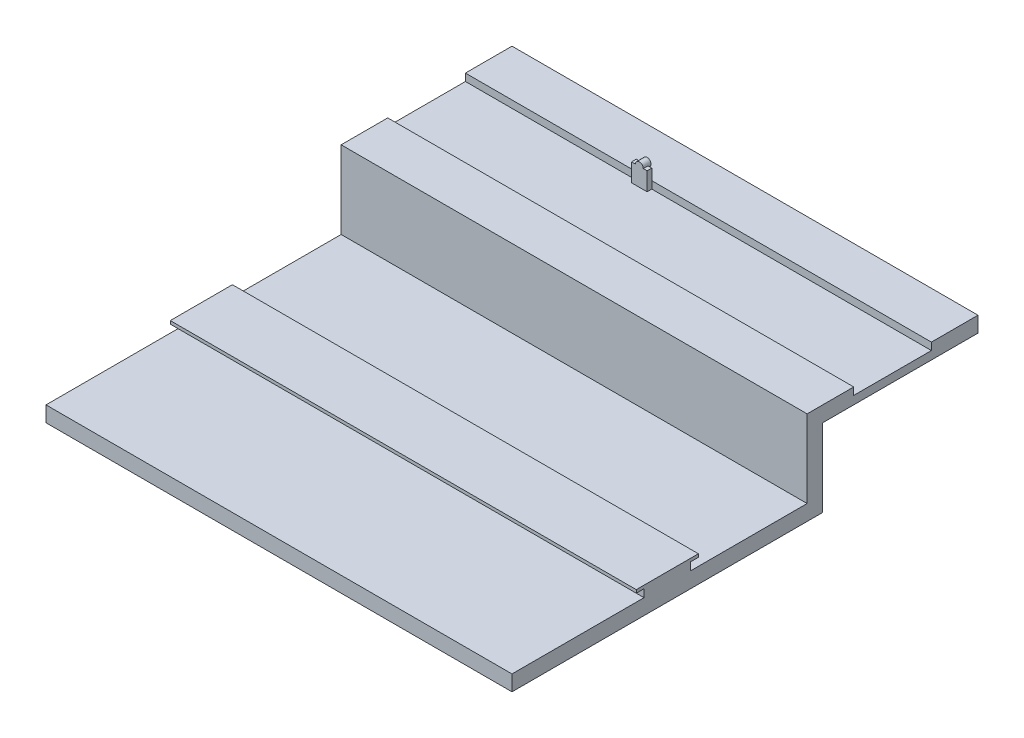
ISO-10303-21;
HEADER;
FILE_DESCRIPTION(('STEP AP214'),'2;1');
FILE_NAME('part.step','',(''),(''),'','','');
FILE_SCHEMA(('AUTOMOTIVE_DESIGN { 1 0 10303 214 1 1 1 1 }'));
ENDSEC;
DATA;
#1=APPLICATION_CONTEXT('core data for automotive mechanical design processes');
#2=APPLICATION_PROTOCOL_DEFINITION('international standard','automotive_design',2000,#1);
#3=PRODUCT_CONTEXT('',#1,'mechanical');
#4=PRODUCT('Part','Part','',(#3));
#5=PRODUCT_RELATED_PRODUCT_CATEGORY('part','',(#4));
#6=PRODUCT_DEFINITION_FORMATION('','',#4);
#7=PRODUCT_DEFINITION_CONTEXT('part definition',#1,'design');
#8=PRODUCT_DEFINITION('design','',#6,#7);
#9=PRODUCT_DEFINITION_SHAPE('','',#8);
#10=(LENGTH_UNIT() NAMED_UNIT(*) SI_UNIT(.MILLI.,.METRE.));
#11=(NAMED_UNIT(*) PLANE_ANGLE_UNIT() SI_UNIT($,.RADIAN.));
#12=(NAMED_UNIT(*) SI_UNIT($,.STERADIAN.) SOLID_ANGLE_UNIT());
#13=UNCERTAINTY_MEASURE_WITH_UNIT(LENGTH_MEASURE(1.E-05),#10,'distance_accuracy_value','');
#14=(GEOMETRIC_REPRESENTATION_CONTEXT(3) GLOBAL_UNCERTAINTY_ASSIGNED_CONTEXT((#13)) GLOBAL_UNIT_ASSIGNED_CONTEXT((#10,
#11,#12)) REPRESENTATION_CONTEXT('',''));
#15=CARTESIAN_POINT('',(0.,0.,0.));
#16=DIRECTION('',(0.,0.,1.));
#17=DIRECTION('',(1.,0.,0.));
#18=AXIS2_PLACEMENT_3D('',#15,#16,#17);
#19=CARTESIAN_POINT('',(-150.00005,67.2828121816727,-170.));
#20=DIRECTION('',(0.,0.,-1.));
#21=DIRECTION('',(-1.,0.,0.));
#22=AXIS2_PLACEMENT_3D('',#19,#20,#21);
#23=PLANE('',#22);
#24=DIRECTION('',(-1.,0.,0.));
#25=VECTOR('',#24,1.);
#26=CARTESIAN_POINT('',(-150.,55.,-170.));
#27=LINE('',#26,#25);
#28=CARTESIAN_POINT('',(150.,55.,-170.));
#29=VERTEX_POINT('',#28);
#30=CARTESIAN_POINT('',(-30.,55.,-170.));
#31=VERTEX_POINT('',#30);
#32=EDGE_CURVE('E324',#29,#31,#27,.T.);
#33=ORIENTED_EDGE('',*,*,#32,.T.);
#34=DIRECTION('',(0.,-1.,0.));
#35=VECTOR('',#34,1.);
#36=CARTESIAN_POINT('',(-30.,67.2828121816727,-170.));
#37=LINE('',#36,#35);
#38=CARTESIAN_POINT('',(-30.,50.2867748096281,-170.));
#39=VERTEX_POINT('',#38);
#40=EDGE_CURVE('E45',#31,#39,#37,.T.);
#41=ORIENTED_EDGE('',*,*,#40,.T.);
#42=DIRECTION('',(1.,0.,0.));
#43=VECTOR('',#42,1.);
#44=CARTESIAN_POINT('',(-150.00005,50.2867748096281,-170.));
#45=LINE('',#44,#43);
#46=CARTESIAN_POINT('',(150.,50.2867748096281,-170.));
#47=VERTEX_POINT('',#46);
#48=EDGE_CURVE('E283',#39,#47,#45,.T.);
#49=ORIENTED_EDGE('',*,*,#48,.T.);
#50=DIRECTION('',(0.,1.,0.));
#51=VECTOR('',#50,1.);
#52=CARTESIAN_POINT('',(150.,67.2828121816727,-170.));
#53=LINE('',#52,#51);
#54=EDGE_CURVE('E60',#47,#29,#53,.T.);
#55=ORIENTED_EDGE('',*,*,#54,.T.);
#56=EDGE_LOOP('',(#33,#41,#49,#55));
#57=FACE_BOUND('',#56,.T.);
#58=ADVANCED_FACE('F37',(#57),#23,.F.);
#59=CARTESIAN_POINT('',(-150.,55.,-90.));
#60=DIRECTION('',(0.,1.,0.));
#61=DIRECTION('',(0.,0.,1.));
#62=AXIS2_PLACEMENT_3D('',#59,#60,#61);
#63=PLANE('',#62);
#64=DIRECTION('',(1.,0.,0.));
#65=VECTOR('',#64,1.);
#66=CARTESIAN_POINT('',(-150.,55.,-120.));
#67=LINE('',#66,#65);
#68=CARTESIAN_POINT('',(-150.,55.,-120.));
#69=VERTEX_POINT('',#68);
#70=CARTESIAN_POINT('',(150.,55.,-120.));
#71=VERTEX_POINT('',#70);
#72=EDGE_CURVE('E326',#69,#71,#67,.T.);
#73=ORIENTED_EDGE('',*,*,#72,.F.);
#74=DIRECTION('',(0.,0.,1.));
#75=VECTOR('',#74,1.);
#76=CARTESIAN_POINT('',(-150.,55.,-100.));
#77=LINE('',#76,#75);
#78=CARTESIAN_POINT('',(-150.,55.,-90.));
#79=VERTEX_POINT('',#78);
#80=EDGE_CURVE('E361',#69,#79,#77,.T.);
#81=ORIENTED_EDGE('',*,*,#80,.T.);
#82=DIRECTION('',(1.,0.,0.));
#83=VECTOR('',#82,1.);
#84=CARTESIAN_POINT('',(-150.,55.,-90.));
#85=LINE('',#84,#83);
#86=CARTESIAN_POINT('',(150.,55.,-90.));
#87=VERTEX_POINT('',#86);
#88=EDGE_CURVE('E354',#79,#87,#85,.T.);
#89=ORIENTED_EDGE('',*,*,#88,.T.);
#90=DIRECTION('',(0.,0.,-1.));
#91=VECTOR('',#90,1.);
#92=CARTESIAN_POINT('',(150.,55.,-100.));
#93=LINE('',#92,#91);
#94=EDGE_CURVE('E353',#87,#71,#93,.T.);
#95=ORIENTED_EDGE('',*,*,#94,.T.);
#96=EDGE_LOOP('',(#73,#81,#89,#95));
#97=FACE_BOUND('',#96,.T.);
#98=ADVANCED_FACE('F535',(#97),#63,.T.);
#99=CARTESIAN_POINT('',(150.,5.,-100.));
#100=DIRECTION('',(0.,0.,1.));
#101=DIRECTION('',(1.,0.,0.));
#102=AXIS2_PLACEMENT_3D('',#99,#100,#101);
#103=PLANE('',#102);
#104=DIRECTION('',(-1.,0.,0.));
#105=VECTOR('',#104,1.);
#106=CARTESIAN_POINT('',(150.,45.,-100.));
#107=LINE('',#106,#105);
#108=CARTESIAN_POINT('',(150.,45.,-100.));
#109=VERTEX_POINT('',#108);
#110=CARTESIAN_POINT('',(-150.,45.,-100.));
#111=VERTEX_POINT('',#110);
#112=EDGE_CURVE('E290',#109,#111,#107,.T.);
#113=ORIENTED_EDGE('',*,*,#112,.F.);
#114=DIRECTION('',(0.,1.,0.));
#115=VECTOR('',#114,1.);
#116=CARTESIAN_POINT('',(150.,5.,-100.));
#117=LINE('',#116,#115);
#118=CARTESIAN_POINT('',(150.,-5.,-100.));
#119=VERTEX_POINT('',#118);
#120=EDGE_CURVE('E311',#119,#109,#117,.T.);
#121=ORIENTED_EDGE('',*,*,#120,.F.);
#122=DIRECTION('',(-1.,0.,0.));
#123=VECTOR('',#122,1.);
#124=CARTESIAN_POINT('',(150.,-5.,-100.));
#125=LINE('',#124,#123);
#126=CARTESIAN_POINT('',(-150.,-5.,-100.));
#127=VERTEX_POINT('',#126);
#128=EDGE_CURVE('E407',#119,#127,#125,.T.);
#129=ORIENTED_EDGE('',*,*,#128,.T.);
#130=DIRECTION('',(0.,1.,0.));
#131=VECTOR('',#130,1.);
#132=CARTESIAN_POINT('',(-150.,5.,-100.));
#133=LINE('',#132,#131);
#134=EDGE_CURVE('E398',#127,#111,#133,.T.);
#135=ORIENTED_EDGE('',*,*,#134,.T.);
#136=EDGE_LOOP('',(#113,#121,#129,#135));
#137=FACE_BOUND('',#136,.T.);
#138=ADVANCED_FACE('F495',(#137),#103,.F.);
#139=CARTESIAN_POINT('',(150.,5.,-15.));
#140=DIRECTION('',(0.,-1.,0.));
#141=DIRECTION('',(0.,0.,-1.));
#142=AXIS2_PLACEMENT_3D('',#139,#140,#141);
#143=PLANE('',#142);
#144=DIRECTION('',(1.,0.,0.));
#145=VECTOR('',#144,1.);
#146=CARTESIAN_POINT('',(-150.,5.,-90.));
#147=LINE('',#146,#145);
#148=CARTESIAN_POINT('',(-150.,5.,-90.));
#149=VERTEX_POINT('',#148);
#150=CARTESIAN_POINT('',(150.,5.,-90.));
#151=VERTEX_POINT('',#150);
#152=EDGE_CURVE('E321',#149,#151,#147,.T.);
#153=ORIENTED_EDGE('',*,*,#152,.F.);
#154=DIRECTION('',(0.,0.,1.));
#155=VECTOR('',#154,1.);
#156=CARTESIAN_POINT('',(-150.,5.,-15.));
#157=LINE('',#156,#155);
#158=CARTESIAN_POINT('',(-150.,5.,-15.));
#159=VERTEX_POINT('',#158);
#160=EDGE_CURVE('E401',#149,#159,#157,.T.);
#161=ORIENTED_EDGE('',*,*,#160,.T.);
#162=DIRECTION('',(-1.,0.,0.));
#163=VECTOR('',#162,1.);
#164=CARTESIAN_POINT('',(150.,5.,-15.));
#165=LINE('',#164,#163);
#166=CARTESIAN_POINT('',(150.,5.,-15.));
#167=VERTEX_POINT('',#166);
#168=EDGE_CURVE('E410',#167,#159,#165,.T.);
#169=ORIENTED_EDGE('',*,*,#168,.F.);
#170=DIRECTION('',(0.,0.,1.));
#171=VECTOR('',#170,1.);
#172=CARTESIAN_POINT('',(150.,5.,-15.));
#173=LINE('',#172,#171);
#174=EDGE_CURVE('E375',#151,#167,#173,.T.);
#175=ORIENTED_EDGE('',*,*,#174,.F.);
#176=EDGE_LOOP('',(#153,#161,#169,#175));
#177=FACE_BOUND('',#176,.T.);
#178=ADVANCED_FACE('F455',(#177),#143,.F.);
#179=CARTESIAN_POINT('',(150.,5.,100.));
#180=DIRECTION('',(0.,0.,-1.));
#181=DIRECTION('',(-1.,0.,0.));
#182=AXIS2_PLACEMENT_3D('',#179,#180,#181);
#183=PLANE('',#182);
#184=DIRECTION('',(0.,-1.,0.));
#185=VECTOR('',#184,1.);
#186=CARTESIAN_POINT('',(-150.,5.,100.));
#187=LINE('',#186,#185);
#188=CARTESIAN_POINT('',(-150.,5.,100.));
#189=VERTEX_POINT('',#188);
#190=CARTESIAN_POINT('',(-150.,-5.,100.));
#191=VERTEX_POINT('',#190);
#192=EDGE_CURVE('E367',#189,#191,#187,.T.);
#193=ORIENTED_EDGE('',*,*,#192,.T.);
#194=DIRECTION('',(-1.,0.,0.));
#195=VECTOR('',#194,1.);
#196=CARTESIAN_POINT('',(150.,-5.,100.));
#197=LINE('',#196,#195);
#198=CARTESIAN_POINT('',(150.,-5.,100.));
#199=VERTEX_POINT('',#198);
#200=EDGE_CURVE('E404',#199,#191,#197,.T.);
#201=ORIENTED_EDGE('',*,*,#200,.F.);
#202=DIRECTION('',(0.,-1.,0.));
#203=VECTOR('',#202,1.);
#204=CARTESIAN_POINT('',(150.,5.,100.));
#205=LINE('',#204,#203);
#206=CARTESIAN_POINT('',(150.,5.,100.));
#207=VERTEX_POINT('',#206);
#208=EDGE_CURVE('E368',#207,#199,#205,.T.);
#209=ORIENTED_EDGE('',*,*,#208,.F.);
#210=DIRECTION('',(-1.,0.,0.));
#211=VECTOR('',#210,1.);
#212=CARTESIAN_POINT('',(150.,5.,100.));
#213=LINE('',#212,#211);
#214=EDGE_CURVE('E393',#207,#189,#213,.T.);
#215=ORIENTED_EDGE('',*,*,#214,.T.);
#216=EDGE_LOOP('',(#193,#201,#209,#215));
#217=FACE_BOUND('',#216,.T.);
#218=ADVANCED_FACE('F39',(#217),#183,.F.);
#219=CARTESIAN_POINT('',(150.,-5.,100.));
#220=DIRECTION('',(0.,1.,0.));
#221=DIRECTION('',(0.,0.,1.));
#222=AXIS2_PLACEMENT_3D('',#219,#220,#221);
#223=PLANE('',#222);
#224=DIRECTION('',(0.,0.,-1.));
#225=VECTOR('',#224,1.);
#226=CARTESIAN_POINT('',(-150.,-5.,100.));
#227=LINE('',#226,#225);
#228=EDGE_CURVE('E396',#191,#127,#227,.T.);
#229=ORIENTED_EDGE('',*,*,#228,.T.);
#230=ORIENTED_EDGE('',*,*,#128,.F.);
#231=DIRECTION('',(0.,0.,-1.));
#232=VECTOR('',#231,1.);
#233=CARTESIAN_POINT('',(150.,-5.,100.));
#234=LINE('',#233,#232);
#235=EDGE_CURVE('E371',#199,#119,#234,.T.);
#236=ORIENTED_EDGE('',*,*,#235,.F.);
#237=ORIENTED_EDGE('',*,*,#200,.T.);
#238=EDGE_LOOP('',(#229,#230,#236,#237));
#239=FACE_BOUND('',#238,.T.);
#240=ADVANCED_FACE('F500',(#239),#223,.F.);
#241=CARTESIAN_POINT('',(150.,10.,-15.));
#242=DIRECTION('',(0.,0.,1.));
#243=DIRECTION('',(0.,-1.,0.));
#244=AXIS2_PLACEMENT_3D('',#241,#242,#243);
#245=PLANE('',#244);
#246=DIRECTION('',(0.,1.,0.));
#247=VECTOR('',#246,1.);
#248=CARTESIAN_POINT('',(-150.,10.,-15.));
#249=LINE('',#248,#247);
#250=CARTESIAN_POINT('',(-150.,10.,-15.));
#251=VERTEX_POINT('',#250);
#252=EDGE_CURVE('E448',#159,#251,#249,.T.);
#253=ORIENTED_EDGE('',*,*,#252,.T.);
#254=DIRECTION('',(-1.,0.,0.));
#255=VECTOR('',#254,1.);
#256=CARTESIAN_POINT('',(150.,10.,-15.));
#257=LINE('',#256,#255);
#258=CARTESIAN_POINT('',(150.,10.,-15.));
#259=VERTEX_POINT('',#258);
#260=EDGE_CURVE('E413',#259,#251,#257,.T.);
#261=ORIENTED_EDGE('',*,*,#260,.F.);
#262=DIRECTION('',(0.,1.,0.));
#263=VECTOR('',#262,1.);
#264=CARTESIAN_POINT('',(150.,10.,-15.));
#265=LINE('',#264,#263);
#266=EDGE_CURVE('E377',#167,#259,#265,.T.);
#267=ORIENTED_EDGE('',*,*,#266,.F.);
#268=ORIENTED_EDGE('',*,*,#168,.T.);
#269=EDGE_LOOP('',(#253,#261,#267,#268));
#270=FACE_BOUND('',#269,.T.);
#271=ADVANCED_FACE('F459',(#270),#245,.F.);
#272=CARTESIAN_POINT('',(150.,10.,-15.));
#273=DIRECTION('',(0.,1.,0.));
#274=DIRECTION('',(0.,0.,1.));
#275=AXIS2_PLACEMENT_3D('',#272,#273,#274);
#276=PLANE('',#275);
#277=DIRECTION('',(0.,0.,-1.));
#278=VECTOR('',#277,1.);
#279=CARTESIAN_POINT('',(-150.,10.,-15.));
#280=LINE('',#279,#278);
#281=CARTESIAN_POINT('',(-150.,10.,-20.));
#282=VERTEX_POINT('',#281);
#283=EDGE_CURVE('E447',#251,#282,#280,.T.);
#284=ORIENTED_EDGE('',*,*,#283,.T.);
#285=DIRECTION('',(-1.,0.,0.));
#286=VECTOR('',#285,1.);
#287=CARTESIAN_POINT('',(150.,10.,-20.));
#288=LINE('',#287,#286);
#289=CARTESIAN_POINT('',(150.,10.,-20.));
#290=VERTEX_POINT('',#289);
#291=EDGE_CURVE('E416',#290,#282,#288,.T.);
#292=ORIENTED_EDGE('',*,*,#291,.F.);
#293=DIRECTION('',(0.,0.,-1.));
#294=VECTOR('',#293,1.);
#295=CARTESIAN_POINT('',(150.,10.,-15.));
#296=LINE('',#295,#294);
#297=EDGE_CURVE('E379',#259,#290,#296,.T.);
#298=ORIENTED_EDGE('',*,*,#297,.F.);
#299=ORIENTED_EDGE('',*,*,#260,.T.);
#300=EDGE_LOOP('',(#284,#292,#298,#299));
#301=FACE_BOUND('',#300,.T.);
#302=ADVANCED_FACE('F467',(#301),#276,.F.);
#303=CARTESIAN_POINT('',(150.,12.,-20.));
#304=DIRECTION('',(0.,0.,1.));
#305=DIRECTION('',(1.,0.,0.));
#306=AXIS2_PLACEMENT_3D('',#303,#304,#305);
#307=PLANE('',#306);
#308=DIRECTION('',(0.,1.,0.));
#309=VECTOR('',#308,1.);
#310=CARTESIAN_POINT('',(-150.,12.,-20.));
#311=LINE('',#310,#309);
#312=CARTESIAN_POINT('',(-150.,12.,-20.));
#313=VERTEX_POINT('',#312);
#314=EDGE_CURVE('E445',#282,#313,#311,.T.);
#315=ORIENTED_EDGE('',*,*,#314,.T.);
#316=DIRECTION('',(-1.,0.,0.));
#317=VECTOR('',#316,1.);
#318=CARTESIAN_POINT('',(150.,12.,-20.));
#319=LINE('',#318,#317);
#320=CARTESIAN_POINT('',(150.,12.,-20.));
#321=VERTEX_POINT('',#320);
#322=EDGE_CURVE('E419',#321,#313,#319,.T.);
#323=ORIENTED_EDGE('',*,*,#322,.F.);
#324=DIRECTION('',(0.,1.,0.));
#325=VECTOR('',#324,1.);
#326=CARTESIAN_POINT('',(150.,12.,-20.));
#327=LINE('',#326,#325);
#328=EDGE_CURVE('E381',#290,#321,#327,.T.);
#329=ORIENTED_EDGE('',*,*,#328,.F.);
#330=ORIENTED_EDGE('',*,*,#291,.T.);
#331=EDGE_LOOP('',(#315,#323,#329,#330));
#332=FACE_BOUND('',#331,.T.);
#333=ADVANCED_FACE('F471',(#332),#307,.F.);
#334=CARTESIAN_POINT('',(150.,12.,20.));
#335=DIRECTION('',(0.,-1.,0.));
#336=DIRECTION('',(0.,0.,-1.));
#337=AXIS2_PLACEMENT_3D('',#334,#335,#336);
#338=PLANE('',#337);
#339=DIRECTION('',(0.,0.,1.));
#340=VECTOR('',#339,1.);
#341=CARTESIAN_POINT('',(-150.,12.,20.));
#342=LINE('',#341,#340);
#343=CARTESIAN_POINT('',(-150.,12.,20.));
#344=VERTEX_POINT('',#343);
#345=EDGE_CURVE('E443',#313,#344,#342,.T.);
#346=ORIENTED_EDGE('',*,*,#345,.T.);
#347=DIRECTION('',(-1.,0.,0.));
#348=VECTOR('',#347,1.);
#349=CARTESIAN_POINT('',(150.,12.,20.));
#350=LINE('',#349,#348);
#351=CARTESIAN_POINT('',(150.,12.,20.));
#352=VERTEX_POINT('',#351);
#353=EDGE_CURVE('E422',#352,#344,#350,.T.);
#354=ORIENTED_EDGE('',*,*,#353,.F.);
#355=DIRECTION('',(0.,0.,1.));
#356=VECTOR('',#355,1.);
#357=CARTESIAN_POINT('',(150.,12.,20.));
#358=LINE('',#357,#356);
#359=EDGE_CURVE('E383',#321,#352,#358,.T.);
#360=ORIENTED_EDGE('',*,*,#359,.F.);
#361=ORIENTED_EDGE('',*,*,#322,.T.);
#362=EDGE_LOOP('',(#346,#354,#360,#361));
#363=FACE_BOUND('',#362,.T.);
#364=ADVANCED_FACE('F525',(#363),#338,.F.);
#365=CARTESIAN_POINT('',(150.,12.,20.));
#366=DIRECTION('',(0.,0.,-1.));
#367=DIRECTION('',(0.,1.,0.));
#368=AXIS2_PLACEMENT_3D('',#365,#366,#367);
#369=PLANE('',#368);
#370=DIRECTION('',(0.,-1.,0.));
#371=VECTOR('',#370,1.);
#372=CARTESIAN_POINT('',(-150.,12.,20.));
#373=LINE('',#372,#371);
#374=CARTESIAN_POINT('',(-150.,10.,20.));
#375=VERTEX_POINT('',#374);
#376=EDGE_CURVE('E441',#344,#375,#373,.T.);
#377=ORIENTED_EDGE('',*,*,#376,.T.);
#378=DIRECTION('',(-1.,0.,0.));
#379=VECTOR('',#378,1.);
#380=CARTESIAN_POINT('',(150.,10.,20.));
#381=LINE('',#380,#379);
#382=CARTESIAN_POINT('',(150.,10.,20.));
#383=VERTEX_POINT('',#382);
#384=EDGE_CURVE('E425',#383,#375,#381,.T.);
#385=ORIENTED_EDGE('',*,*,#384,.F.);
#386=DIRECTION('',(0.,-1.,0.));
#387=VECTOR('',#386,1.);
#388=CARTESIAN_POINT('',(150.,12.,20.));
#389=LINE('',#388,#387);
#390=EDGE_CURVE('E385',#352,#383,#389,.T.);
#391=ORIENTED_EDGE('',*,*,#390,.F.);
#392=ORIENTED_EDGE('',*,*,#353,.T.);
#393=EDGE_LOOP('',(#377,#385,#391,#392));
#394=FACE_BOUND('',#393,.T.);
#395=ADVANCED_FACE('F522',(#394),#369,.F.);
#396=CARTESIAN_POINT('',(150.,10.,20.));
#397=DIRECTION('',(0.,1.,0.));
#398=DIRECTION('',(0.,0.,1.));
#399=AXIS2_PLACEMENT_3D('',#396,#397,#398);
#400=PLANE('',#399);
#401=DIRECTION('',(0.,0.,-1.));
#402=VECTOR('',#401,1.);
#403=CARTESIAN_POINT('',(-150.,10.,20.));
#404=LINE('',#403,#402);
#405=CARTESIAN_POINT('',(-150.,10.,15.));
#406=VERTEX_POINT('',#405);
#407=EDGE_CURVE('E439',#375,#406,#404,.T.);
#408=ORIENTED_EDGE('',*,*,#407,.T.);
#409=DIRECTION('',(-1.,0.,0.));
#410=VECTOR('',#409,1.);
#411=CARTESIAN_POINT('',(150.,10.,15.));
#412=LINE('',#411,#410);
#413=CARTESIAN_POINT('',(150.,10.,15.));
#414=VERTEX_POINT('',#413);
#415=EDGE_CURVE('E428',#414,#406,#412,.T.);
#416=ORIENTED_EDGE('',*,*,#415,.F.);
#417=DIRECTION('',(0.,0.,-1.));
#418=VECTOR('',#417,1.);
#419=CARTESIAN_POINT('',(150.,10.,20.));
#420=LINE('',#419,#418);
#421=EDGE_CURVE('E387',#383,#414,#420,.T.);
#422=ORIENTED_EDGE('',*,*,#421,.F.);
#423=ORIENTED_EDGE('',*,*,#384,.T.);
#424=EDGE_LOOP('',(#408,#416,#422,#423));
#425=FACE_BOUND('',#424,.T.);
#426=ADVANCED_FACE('F518',(#425),#400,.F.);
#427=CARTESIAN_POINT('',(150.,10.,15.));
#428=DIRECTION('',(0.,0.,-1.));
#429=DIRECTION('',(-1.,0.,0.));
#430=AXIS2_PLACEMENT_3D('',#427,#428,#429);
#431=PLANE('',#430);
#432=DIRECTION('',(0.,-1.,0.));
#433=VECTOR('',#432,1.);
#434=CARTESIAN_POINT('',(-150.,10.,15.));
#435=LINE('',#434,#433);
#436=CARTESIAN_POINT('',(-150.,5.,15.));
#437=VERTEX_POINT('',#436);
#438=EDGE_CURVE('E437',#406,#437,#435,.T.);
#439=ORIENTED_EDGE('',*,*,#438,.T.);
#440=DIRECTION('',(-1.,0.,0.));
#441=VECTOR('',#440,1.);
#442=CARTESIAN_POINT('',(150.,5.,15.));
#443=LINE('',#442,#441);
#444=CARTESIAN_POINT('',(150.,5.,15.));
#445=VERTEX_POINT('',#444);
#446=EDGE_CURVE('E431',#445,#437,#443,.T.);
#447=ORIENTED_EDGE('',*,*,#446,.F.);
#448=DIRECTION('',(0.,-1.,0.));
#449=VECTOR('',#448,1.);
#450=CARTESIAN_POINT('',(150.,10.,15.));
#451=LINE('',#450,#449);
#452=EDGE_CURVE('E389',#414,#445,#451,.T.);
#453=ORIENTED_EDGE('',*,*,#452,.F.);
#454=ORIENTED_EDGE('',*,*,#415,.T.);
#455=EDGE_LOOP('',(#439,#447,#453,#454));
#456=FACE_BOUND('',#455,.T.);
#457=ADVANCED_FACE('F514',(#456),#431,.F.);
#458=CARTESIAN_POINT('',(150.,5.,100.));
#459=DIRECTION('',(0.,-1.,0.));
#460=DIRECTION('',(0.,0.,-1.));
#461=AXIS2_PLACEMENT_3D('',#458,#459,#460);
#462=PLANE('',#461);
#463=DIRECTION('',(0.,0.,1.));
#464=VECTOR('',#463,1.);
#465=CARTESIAN_POINT('',(-150.,5.,100.));
#466=LINE('',#465,#464);
#467=EDGE_CURVE('E372',#437,#189,#466,.T.);
#468=ORIENTED_EDGE('',*,*,#467,.T.);
#469=ORIENTED_EDGE('',*,*,#214,.F.);
#470=DIRECTION('',(0.,0.,1.));
#471=VECTOR('',#470,1.);
#472=CARTESIAN_POINT('',(150.,5.,100.));
#473=LINE('',#472,#471);
#474=EDGE_CURVE('E391',#445,#207,#473,.T.);
#475=ORIENTED_EDGE('',*,*,#474,.F.);
#476=ORIENTED_EDGE('',*,*,#446,.T.);
#477=EDGE_LOOP('',(#468,#469,#475,#476));
#478=FACE_BOUND('',#477,.T.);
#479=ADVANCED_FACE('F509',(#478),#462,.F.);
#480=CARTESIAN_POINT('',(150.,-5.,100.));
#481=DIRECTION('',(1.,0.,0.));
#482=DIRECTION('',(0.,0.,-1.));
#483=AXIS2_PLACEMENT_3D('',#480,#481,#482);
#484=PLANE('',#483);
#485=DIRECTION('',(0.,-1.,0.));
#486=VECTOR('',#485,1.);
#487=CARTESIAN_POINT('',(150.,67.2828121816727,-120.));
#488=LINE('',#487,#486);
#489=CARTESIAN_POINT('',(150.,50.2867748096281,-120.));
#490=VERTEX_POINT('',#489);
#491=EDGE_CURVE('E271',#71,#490,#488,.T.);
#492=ORIENTED_EDGE('',*,*,#491,.F.);
#493=ORIENTED_EDGE('',*,*,#94,.F.);
#494=DIRECTION('',(0.,-1.,0.));
#495=VECTOR('',#494,1.);
#496=CARTESIAN_POINT('',(150.,55.,-90.));
#497=LINE('',#496,#495);
#498=EDGE_CURVE('E357',#87,#151,#497,.T.);
#499=ORIENTED_EDGE('',*,*,#498,.T.);
#500=ORIENTED_EDGE('',*,*,#174,.T.);
#501=ORIENTED_EDGE('',*,*,#266,.T.);
#502=ORIENTED_EDGE('',*,*,#297,.T.);
#503=ORIENTED_EDGE('',*,*,#328,.T.);
#504=ORIENTED_EDGE('',*,*,#359,.T.);
#505=ORIENTED_EDGE('',*,*,#390,.T.);
#506=ORIENTED_EDGE('',*,*,#421,.T.);
#507=ORIENTED_EDGE('',*,*,#452,.T.);
#508=ORIENTED_EDGE('',*,*,#474,.T.);
#509=ORIENTED_EDGE('',*,*,#208,.T.);
#510=ORIENTED_EDGE('',*,*,#235,.T.);
#511=ORIENTED_EDGE('',*,*,#120,.T.);
#512=DIRECTION('',(0.,0.,1.));
#513=VECTOR('',#512,1.);
#514=CARTESIAN_POINT('',(150.,45.,-200.));
#515=LINE('',#514,#513);
#516=CARTESIAN_POINT('',(150.,45.,-200.));
#517=VERTEX_POINT('',#516);
#518=EDGE_CURVE('E316',#517,#109,#515,.T.);
#519=ORIENTED_EDGE('',*,*,#518,.F.);
#520=DIRECTION('',(0.,-1.,0.));
#521=VECTOR('',#520,1.);
#522=CARTESIAN_POINT('',(150.,55.,-200.));
#523=LINE('',#522,#521);
#524=CARTESIAN_POINT('',(150.,55.,-200.));
#525=VERTEX_POINT('',#524);
#526=EDGE_CURVE('E291',#525,#517,#523,.T.);
#527=ORIENTED_EDGE('',*,*,#526,.F.);
#528=EDGE_CURVE('E349',#29,#525,#93,.T.);
#529=ORIENTED_EDGE('',*,*,#528,.F.);
#530=ORIENTED_EDGE('',*,*,#54,.F.);
#531=DIRECTION('',(0.,0.,-1.));
#532=VECTOR('',#531,1.);
#533=CARTESIAN_POINT('',(150.,50.2867748096281,-120.));
#534=LINE('',#533,#532);
#535=EDGE_CURVE('E274',#490,#47,#534,.T.);
#536=ORIENTED_EDGE('',*,*,#535,.F.);
#537=EDGE_LOOP('',(#492,#493,#499,#500,#501,#502,#503,#504,#505,#506,#507,#508,#509,#510,#511,
#519,#527,#529,#530,#536));
#538=FACE_BOUND('',#537,.T.);
#539=ADVANCED_FACE('F347',(#538),#484,.T.);
#540=CARTESIAN_POINT('',(-150.,-5.,100.));
#541=DIRECTION('',(1.,0.,0.));
#542=DIRECTION('',(0.,0.,-1.));
#543=AXIS2_PLACEMENT_3D('',#540,#541,#542);
#544=PLANE('',#543);
#545=ORIENTED_EDGE('',*,*,#80,.F.);
#546=DIRECTION('',(0.,-1.,0.));
#547=VECTOR('',#546,1.);
#548=CARTESIAN_POINT('',(-150.,-5.,-120.));
#549=LINE('',#548,#547);
#550=CARTESIAN_POINT('',(-150.,50.2867748096281,-120.));
#551=VERTEX_POINT('',#550);
#552=EDGE_CURVE('E287',#69,#551,#549,.T.);
#553=ORIENTED_EDGE('',*,*,#552,.T.);
#554=DIRECTION('',(0.,0.,-1.));
#555=VECTOR('',#554,1.);
#556=CARTESIAN_POINT('',(-150.,50.2867748096281,100.));
#557=LINE('',#556,#555);
#558=CARTESIAN_POINT('',(-150.,50.2867748096281,-170.));
#559=VERTEX_POINT('',#558);
#560=EDGE_CURVE('E330',#551,#559,#557,.T.);
#561=ORIENTED_EDGE('',*,*,#560,.T.);
#562=DIRECTION('',(0.,1.,0.));
#563=VECTOR('',#562,1.);
#564=CARTESIAN_POINT('',(-150.,-5.,-170.));
#565=LINE('',#564,#563);
#566=CARTESIAN_POINT('',(-150.,55.,-170.));
#567=VERTEX_POINT('',#566);
#568=EDGE_CURVE('E282',#559,#567,#565,.T.);
#569=ORIENTED_EDGE('',*,*,#568,.T.);
#570=CARTESIAN_POINT('',(-150.,55.,-200.));
#571=VERTEX_POINT('',#570);
#572=EDGE_CURVE('E305',#571,#567,#77,.T.);
#573=ORIENTED_EDGE('',*,*,#572,.F.);
#574=DIRECTION('',(0.,1.,0.));
#575=VECTOR('',#574,1.);
#576=CARTESIAN_POINT('',(-150.,55.,-200.));
#577=LINE('',#576,#575);
#578=CARTESIAN_POINT('',(-150.,45.,-200.));
#579=VERTEX_POINT('',#578);
#580=EDGE_CURVE('E296',#579,#571,#577,.T.);
#581=ORIENTED_EDGE('',*,*,#580,.F.);
#582=DIRECTION('',(0.,0.,1.));
#583=VECTOR('',#582,1.);
#584=CARTESIAN_POINT('',(-150.,45.,-200.));
#585=LINE('',#584,#583);
#586=EDGE_CURVE('E302',#579,#111,#585,.T.);
#587=ORIENTED_EDGE('',*,*,#586,.T.);
#588=ORIENTED_EDGE('',*,*,#134,.F.);
#589=ORIENTED_EDGE('',*,*,#228,.F.);
#590=ORIENTED_EDGE('',*,*,#192,.F.);
#591=ORIENTED_EDGE('',*,*,#467,.F.);
#592=ORIENTED_EDGE('',*,*,#438,.F.);
#593=ORIENTED_EDGE('',*,*,#407,.F.);
#594=ORIENTED_EDGE('',*,*,#376,.F.);
#595=ORIENTED_EDGE('',*,*,#345,.F.);
#596=ORIENTED_EDGE('',*,*,#314,.F.);
#597=ORIENTED_EDGE('',*,*,#283,.F.);
#598=ORIENTED_EDGE('',*,*,#252,.F.);
#599=ORIENTED_EDGE('',*,*,#160,.F.);
#600=DIRECTION('',(0.,-1.,0.));
#601=VECTOR('',#600,1.);
#602=CARTESIAN_POINT('',(-150.,55.,-90.));
#603=LINE('',#602,#601);
#604=EDGE_CURVE('E364',#79,#149,#603,.T.);
#605=ORIENTED_EDGE('',*,*,#604,.F.);
#606=EDGE_LOOP('',(#545,#553,#561,#569,#573,#581,#587,#588,#589,#590,#591,#592,#593,#594,#595,
#596,#597,#598,#599,#605));
#607=FACE_BOUND('',#606,.T.);
#608=ADVANCED_FACE('F462',(#607),#544,.F.);
#609=CARTESIAN_POINT('',(-150.,55.,-90.));
#610=DIRECTION('',(0.,0.,-1.));
#611=DIRECTION('',(-1.,0.,0.));
#612=AXIS2_PLACEMENT_3D('',#609,#610,#611);
#613=PLANE('',#612);
#614=ORIENTED_EDGE('',*,*,#152,.T.);
#615=ORIENTED_EDGE('',*,*,#498,.F.);
#616=ORIENTED_EDGE('',*,*,#88,.F.);
#617=ORIENTED_EDGE('',*,*,#604,.T.);
#618=EDGE_LOOP('',(#614,#615,#616,#617));
#619=FACE_BOUND('',#618,.T.);
#620=ADVANCED_FACE('F478',(#619),#613,.F.);
#621=ORIENTED_EDGE('',*,*,#32,.F.);
#622=ORIENTED_EDGE('',*,*,#528,.T.);
#623=DIRECTION('',(1.,0.,0.));
#624=VECTOR('',#623,1.);
#625=CARTESIAN_POINT('',(150.,55.,-200.));
#626=LINE('',#625,#624);
#627=EDGE_CURVE('E299',#571,#525,#626,.T.);
#628=ORIENTED_EDGE('',*,*,#627,.F.);
#629=ORIENTED_EDGE('',*,*,#572,.T.);
#630=CARTESIAN_POINT('',(-40.,55.,-170.));
#631=VERTEX_POINT('',#630);
#632=EDGE_CURVE('E328',#631,#567,#27,.T.);
#633=ORIENTED_EDGE('',*,*,#632,.F.);
#634=EDGE_CURVE('E327',#31,#631,#27,.T.);
#635=ORIENTED_EDGE('',*,*,#634,.F.);
#636=EDGE_LOOP('',(#621,#622,#628,#629,#633,#635));
#637=FACE_BOUND('',#636,.T.);
#638=ADVANCED_FACE('F484',(#637),#63,.T.);
#639=CARTESIAN_POINT('',(150.,45.,-200.));
#640=DIRECTION('',(0.,1.,0.));
#641=DIRECTION('',(-1.,0.,0.));
#642=AXIS2_PLACEMENT_3D('',#639,#640,#641);
#643=PLANE('',#642);
#644=ORIENTED_EDGE('',*,*,#112,.T.);
#645=ORIENTED_EDGE('',*,*,#586,.F.);
#646=DIRECTION('',(-1.,0.,0.));
#647=VECTOR('',#646,1.);
#648=CARTESIAN_POINT('',(150.,45.,-200.));
#649=LINE('',#648,#647);
#650=EDGE_CURVE('E294',#517,#579,#649,.T.);
#651=ORIENTED_EDGE('',*,*,#650,.F.);
#652=ORIENTED_EDGE('',*,*,#518,.T.);
#653=EDGE_LOOP('',(#644,#645,#651,#652));
#654=FACE_BOUND('',#653,.T.);
#655=ADVANCED_FACE('F491',(#654),#643,.F.);
#656=CARTESIAN_POINT('',(150.,45.,-200.));
#657=DIRECTION('',(0.,0.,-1.));
#658=DIRECTION('',(-1.,0.,0.));
#659=AXIS2_PLACEMENT_3D('',#656,#657,#658);
#660=PLANE('',#659);
#661=ORIENTED_EDGE('',*,*,#526,.T.);
#662=ORIENTED_EDGE('',*,*,#650,.T.);
#663=ORIENTED_EDGE('',*,*,#580,.T.);
#664=ORIENTED_EDGE('',*,*,#627,.T.);
#665=EDGE_LOOP('',(#661,#662,#663,#664));
#666=FACE_BOUND('',#665,.T.);
#667=ADVANCED_FACE('F488',(#666),#660,.T.);
#668=CARTESIAN_POINT('',(-150.00005,50.2867748096281,-120.));
#669=DIRECTION('',(0.,-1.,0.));
#670=DIRECTION('',(0.,0.,-1.));
#671=AXIS2_PLACEMENT_3D('',#668,#669,#670);
#672=PLANE('',#671);
#673=ORIENTED_EDGE('',*,*,#48,.F.);
#674=DIRECTION('',(0.,0.,1.));
#675=VECTOR('',#674,1.);
#676=CARTESIAN_POINT('',(-30.,50.2867748096281,-120.));
#677=LINE('',#676,#675);
#678=CARTESIAN_POINT('',(-30.,50.2867748096281,-167.));
#679=VERTEX_POINT('',#678);
#680=EDGE_CURVE('E268',#39,#679,#677,.T.);
#681=ORIENTED_EDGE('',*,*,#680,.T.);
#682=DIRECTION('',(1.,0.,0.));
#683=VECTOR('',#682,1.);
#684=CARTESIAN_POINT('',(-150.00005,50.2867748096281,-167.));
#685=LINE('',#684,#683);
#686=CARTESIAN_POINT('',(-40.,50.2867748096281,-167.));
#687=VERTEX_POINT('',#686);
#688=EDGE_CURVE('E11',#687,#679,#685,.T.);
#689=ORIENTED_EDGE('',*,*,#688,.F.);
#690=DIRECTION('',(0.,0.,-1.));
#691=VECTOR('',#690,1.);
#692=CARTESIAN_POINT('',(-40.,50.2867748096281,-120.));
#693=LINE('',#692,#691);
#694=CARTESIAN_POINT('',(-40.,50.2867748096281,-170.));
#695=VERTEX_POINT('',#694);
#696=EDGE_CURVE('E263',#687,#695,#693,.T.);
#697=ORIENTED_EDGE('',*,*,#696,.T.);
#698=EDGE_CURVE('E279',#559,#695,#45,.T.);
#699=ORIENTED_EDGE('',*,*,#698,.F.);
#700=ORIENTED_EDGE('',*,*,#560,.F.);
#701=DIRECTION('',(1.,0.,0.));
#702=VECTOR('',#701,1.);
#703=CARTESIAN_POINT('',(-150.00005,50.2867748096281,-120.));
#704=LINE('',#703,#702);
#705=EDGE_CURVE('E278',#551,#490,#704,.T.);
#706=ORIENTED_EDGE('',*,*,#705,.T.);
#707=ORIENTED_EDGE('',*,*,#535,.T.);
#708=EDGE_LOOP('',(#673,#681,#689,#697,#699,#700,#706,#707));
#709=FACE_BOUND('',#708,.T.);
#710=ADVANCED_FACE('F340',(#709),#672,.F.);
#711=CARTESIAN_POINT('',(-150.00005,67.2828121816727,-120.));
#712=DIRECTION('',(0.,0.,1.));
#713=DIRECTION('',(1.,0.,0.));
#714=AXIS2_PLACEMENT_3D('',#711,#712,#713);
#715=PLANE('',#714);
#716=ORIENTED_EDGE('',*,*,#72,.T.);
#717=ORIENTED_EDGE('',*,*,#491,.T.);
#718=ORIENTED_EDGE('',*,*,#705,.F.);
#719=ORIENTED_EDGE('',*,*,#552,.F.);
#720=EDGE_LOOP('',(#716,#717,#718,#719));
#721=FACE_BOUND('',#720,.T.);
#722=ADVANCED_FACE('F546',(#721),#715,.F.);
#723=ORIENTED_EDGE('',*,*,#698,.T.);
#724=DIRECTION('',(0.,1.,0.));
#725=VECTOR('',#724,1.);
#726=CARTESIAN_POINT('',(-40.,67.2828121816727,-170.));
#727=LINE('',#726,#725);
#728=EDGE_CURVE('E333',#695,#631,#727,.T.);
#729=ORIENTED_EDGE('',*,*,#728,.T.);
#730=ORIENTED_EDGE('',*,*,#632,.T.);
#731=ORIENTED_EDGE('',*,*,#568,.F.);
#732=EDGE_LOOP('',(#723,#729,#730,#731));
#733=FACE_BOUND('',#732,.T.);
#734=ADVANCED_FACE('F537',(#733),#23,.F.);
#735=CARTESIAN_POINT('',(-35.,62.,-167.));
#736=DIRECTION('',(0.,0.,-1.));
#737=DIRECTION('',(-1.,0.,0.));
#738=AXIS2_PLACEMENT_3D('',#735,#736,#737);
#739=PLANE('',#738);
#740=DIRECTION('',(1.,0.,0.));
#741=VECTOR('',#740,1.);
#742=CARTESIAN_POINT('',(-30.,62.,-167.));
#743=LINE('',#742,#741);
#744=CARTESIAN_POINT('',(-32.5,62.,-167.));
#745=VERTEX_POINT('',#744);
#746=CARTESIAN_POINT('',(-30.,62.,-167.));
#747=VERTEX_POINT('',#746);
#748=EDGE_CURVE('E256',#745,#747,#743,.T.);
#749=ORIENTED_EDGE('',*,*,#748,.F.);
#750=CARTESIAN_POINT('',(-35.,62.,-167.));
#751=DIRECTION('',(0.,0.,-1.));
#752=DIRECTION('',(-1.,0.,0.));
#753=AXIS2_PLACEMENT_3D('',#750,#751,#752);
#754=CIRCLE('',#753,2.5);
#755=CARTESIAN_POINT('',(-37.5,62.,-167.));
#756=VERTEX_POINT('',#755);
#757=EDGE_CURVE('E254',#756,#745,#754,.T.);
#758=ORIENTED_EDGE('',*,*,#757,.F.);
#759=DIRECTION('',(1.,0.,0.));
#760=VECTOR('',#759,1.);
#761=CARTESIAN_POINT('',(-37.5,62.,-167.));
#762=LINE('',#761,#760);
#763=CARTESIAN_POINT('',(-40.,62.,-167.));
#764=VERTEX_POINT('',#763);
#765=EDGE_CURVE('E230',#764,#756,#762,.T.);
#766=ORIENTED_EDGE('',*,*,#765,.F.);
#767=DIRECTION('',(0.,1.,0.));
#768=VECTOR('',#767,1.);
#769=CARTESIAN_POINT('',(-40.,62.,-167.));
#770=LINE('',#769,#768);
#771=EDGE_CURVE('E251',#687,#764,#770,.T.);
#772=ORIENTED_EDGE('',*,*,#771,.F.);
#773=ORIENTED_EDGE('',*,*,#688,.T.);
#774=DIRECTION('',(0.,-1.,0.));
#775=VECTOR('',#774,1.);
#776=CARTESIAN_POINT('',(-30.,62.,-167.));
#777=LINE('',#776,#775);
#778=EDGE_CURVE('E248',#747,#679,#777,.T.);
#779=ORIENTED_EDGE('',*,*,#778,.F.);
#780=EDGE_LOOP('',(#749,#758,#766,#772,#773,#779));
#781=FACE_BOUND('',#780,.T.);
#782=ADVANCED_FACE('F545',(#781),#739,.F.);
#783=CARTESIAN_POINT('',(-35.,62.,-170.));
#784=DIRECTION('',(0.,0.,-1.));
#785=DIRECTION('',(-1.,0.,0.));
#786=AXIS2_PLACEMENT_3D('',#783,#784,#785);
#787=PLANE('',#786);
#788=CARTESIAN_POINT('',(-35.,62.,-170.));
#789=DIRECTION('',(0.,0.,-1.));
#790=DIRECTION('',(-1.,0.,0.));
#791=AXIS2_PLACEMENT_3D('',#788,#789,#790);
#792=CIRCLE('',#791,2.5);
#793=CARTESIAN_POINT('',(-32.5,62.,-170.));
#794=VERTEX_POINT('',#793);
#795=CARTESIAN_POINT('',(-37.5,62.,-170.));
#796=VERTEX_POINT('',#795);
#797=EDGE_CURVE('E220',#794,#796,#792,.T.);
#798=ORIENTED_EDGE('',*,*,#797,.F.);
#799=DIRECTION('',(1.,0.,0.));
#800=VECTOR('',#799,1.);
#801=CARTESIAN_POINT('',(-30.,62.,-170.));
#802=LINE('',#801,#800);
#803=CARTESIAN_POINT('',(-30.,62.,-170.));
#804=VERTEX_POINT('',#803);
#805=EDGE_CURVE('E224',#794,#804,#802,.T.);
#806=ORIENTED_EDGE('',*,*,#805,.T.);
#807=DIRECTION('',(0.,-1.,0.));
#808=VECTOR('',#807,1.);
#809=CARTESIAN_POINT('',(-30.,62.,-170.));
#810=LINE('',#809,#808);
#811=EDGE_CURVE('E240',#804,#31,#810,.T.);
#812=ORIENTED_EDGE('',*,*,#811,.T.);
#813=ORIENTED_EDGE('',*,*,#634,.T.);
#814=DIRECTION('',(0.,1.,0.));
#815=VECTOR('',#814,1.);
#816=CARTESIAN_POINT('',(-40.,62.,-170.));
#817=LINE('',#816,#815);
#818=CARTESIAN_POINT('',(-40.,62.,-170.));
#819=VERTEX_POINT('',#818);
#820=EDGE_CURVE('E52',#631,#819,#817,.T.);
#821=ORIENTED_EDGE('',*,*,#820,.T.);
#822=DIRECTION('',(1.,0.,0.));
#823=VECTOR('',#822,1.);
#824=CARTESIAN_POINT('',(-37.5,62.,-170.));
#825=LINE('',#824,#823);
#826=EDGE_CURVE('E215',#819,#796,#825,.T.);
#827=ORIENTED_EDGE('',*,*,#826,.T.);
#828=EDGE_LOOP('',(#798,#806,#812,#813,#821,#827));
#829=FACE_BOUND('',#828,.T.);
#830=ADVANCED_FACE('F217',(#829),#787,.T.);
#831=CARTESIAN_POINT('',(-30.,62.,-167.));
#832=DIRECTION('',(1.,0.,0.));
#833=DIRECTION('',(0.,1.,0.));
#834=AXIS2_PLACEMENT_3D('',#831,#832,#833);
#835=PLANE('',#834);
#836=ORIENTED_EDGE('',*,*,#680,.F.);
#837=ORIENTED_EDGE('',*,*,#40,.F.);
#838=ORIENTED_EDGE('',*,*,#811,.F.);
#839=DIRECTION('',(0.,0.,-1.));
#840=VECTOR('',#839,1.);
#841=CARTESIAN_POINT('',(-30.,62.,-167.));
#842=LINE('',#841,#840);
#843=EDGE_CURVE('E261',#747,#804,#842,.T.);
#844=ORIENTED_EDGE('',*,*,#843,.F.);
#845=ORIENTED_EDGE('',*,*,#778,.T.);
#846=EDGE_LOOP('',(#836,#837,#838,#844,#845));
#847=FACE_BOUND('',#846,.T.);
#848=ADVANCED_FACE('F563',(#847),#835,.T.);
#849=CARTESIAN_POINT('',(-40.,62.,-167.));
#850=DIRECTION('',(-1.,0.,0.));
#851=DIRECTION('',(0.,-1.,0.));
#852=AXIS2_PLACEMENT_3D('',#849,#850,#851);
#853=PLANE('',#852);
#854=ORIENTED_EDGE('',*,*,#696,.F.);
#855=ORIENTED_EDGE('',*,*,#771,.T.);
#856=DIRECTION('',(0.,0.,-1.));
#857=VECTOR('',#856,1.);
#858=CARTESIAN_POINT('',(-40.,62.,-167.));
#859=LINE('',#858,#857);
#860=EDGE_CURVE('E235',#764,#819,#859,.T.);
#861=ORIENTED_EDGE('',*,*,#860,.T.);
#862=ORIENTED_EDGE('',*,*,#820,.F.);
#863=ORIENTED_EDGE('',*,*,#728,.F.);
#864=EDGE_LOOP('',(#854,#855,#861,#862,#863));
#865=FACE_BOUND('',#864,.T.);
#866=ADVANCED_FACE('F558',(#865),#853,.T.);
#867=CARTESIAN_POINT('',(-30.,62.,-167.));
#868=DIRECTION('',(0.,1.,0.));
#869=DIRECTION('',(0.,0.,1.));
#870=AXIS2_PLACEMENT_3D('',#867,#868,#869);
#871=PLANE('',#870);
#872=ORIENTED_EDGE('',*,*,#805,.F.);
#873=DIRECTION('',(0.,0.,-1.));
#874=VECTOR('',#873,1.);
#875=CARTESIAN_POINT('',(-32.5,62.,-167.));
#876=LINE('',#875,#874);
#877=EDGE_CURVE('E234',#745,#794,#876,.T.);
#878=ORIENTED_EDGE('',*,*,#877,.F.);
#879=ORIENTED_EDGE('',*,*,#748,.T.);
#880=ORIENTED_EDGE('',*,*,#843,.T.);
#881=EDGE_LOOP('',(#872,#878,#879,#880));
#882=FACE_BOUND('',#881,.T.);
#883=ADVANCED_FACE('F562',(#882),#871,.T.);
#884=CARTESIAN_POINT('',(-35.,62.,-167.));
#885=DIRECTION('',(0.,0.,-1.));
#886=DIRECTION('',(-1.,0.,0.));
#887=AXIS2_PLACEMENT_3D('',#884,#885,#886);
#888=CYLINDRICAL_SURFACE('',#887,2.5);
#889=ORIENTED_EDGE('',*,*,#877,.T.);
#890=ORIENTED_EDGE('',*,*,#797,.T.);
#891=DIRECTION('',(0.,0.,-1.));
#892=VECTOR('',#891,1.);
#893=CARTESIAN_POINT('',(-37.5,62.,-167.));
#894=LINE('',#893,#892);
#895=EDGE_CURVE('E227',#756,#796,#894,.T.);
#896=ORIENTED_EDGE('',*,*,#895,.F.);
#897=ORIENTED_EDGE('',*,*,#757,.T.);
#898=EDGE_LOOP('',(#889,#890,#896,#897));
#899=FACE_BOUND('',#898,.T.);
#900=CARTESIAN_POINT('',(-35.,62.,-172.));
#901=DIRECTION('',(0.,0.,1.));
#902=DIRECTION('',(1.,0.,0.));
#903=AXIS2_PLACEMENT_3D('',#900,#901,#902);
#904=CIRCLE('',#903,2.5);
#905=CARTESIAN_POINT('',(-32.5,62.,-172.));
#906=VERTEX_POINT('',#905);
#907=EDGE_CURVE('E241',#906,#906,#904,.T.);
#908=ORIENTED_EDGE('',*,*,#907,.T.);
#909=EDGE_LOOP('',(#908));
#910=FACE_BOUND('',#909,.T.);
#911=ADVANCED_FACE('F237',(#899,#910),#888,.T.);
#912=CARTESIAN_POINT('',(-37.5,62.,-167.));
#913=DIRECTION('',(0.,1.,0.));
#914=DIRECTION('',(-1.,0.,0.));
#915=AXIS2_PLACEMENT_3D('',#912,#913,#914);
#916=PLANE('',#915);
#917=ORIENTED_EDGE('',*,*,#826,.F.);
#918=ORIENTED_EDGE('',*,*,#860,.F.);
#919=ORIENTED_EDGE('',*,*,#765,.T.);
#920=ORIENTED_EDGE('',*,*,#895,.T.);
#921=EDGE_LOOP('',(#917,#918,#919,#920));
#922=FACE_BOUND('',#921,.T.);
#923=ADVANCED_FACE('F228',(#922),#916,.T.);
#924=CARTESIAN_POINT('',(-35.,62.,-172.));
#925=DIRECTION('',(0.,0.,1.));
#926=DIRECTION('',(1.,0.,0.));
#927=AXIS2_PLACEMENT_3D('',#924,#925,#926);
#928=PLANE('',#927);
#929=ORIENTED_EDGE('',*,*,#907,.F.);
#930=EDGE_LOOP('',(#929));
#931=FACE_BOUND('',#930,.T.);
#932=ADVANCED_FACE('F574',(#931),#928,.F.);
#933=CLOSED_SHELL('',(#58,#98,#138,#178,#218,#240,#271,#302,#333,#364,#395,#426,#457,#479,#539,
#608,#620,#638,#655,#667,#710,#722,#734,#782,#830,#848,#866,#883,#911,#923,#932));
#934=MANIFOLD_SOLID_BREP('B2',#933);
#935=ADVANCED_BREP_SHAPE_REPRESENTATION('',(#18,#934),#14);
#936=SHAPE_DEFINITION_REPRESENTATION(#9,#935);
ENDSEC;
END-ISO-10303-21;
